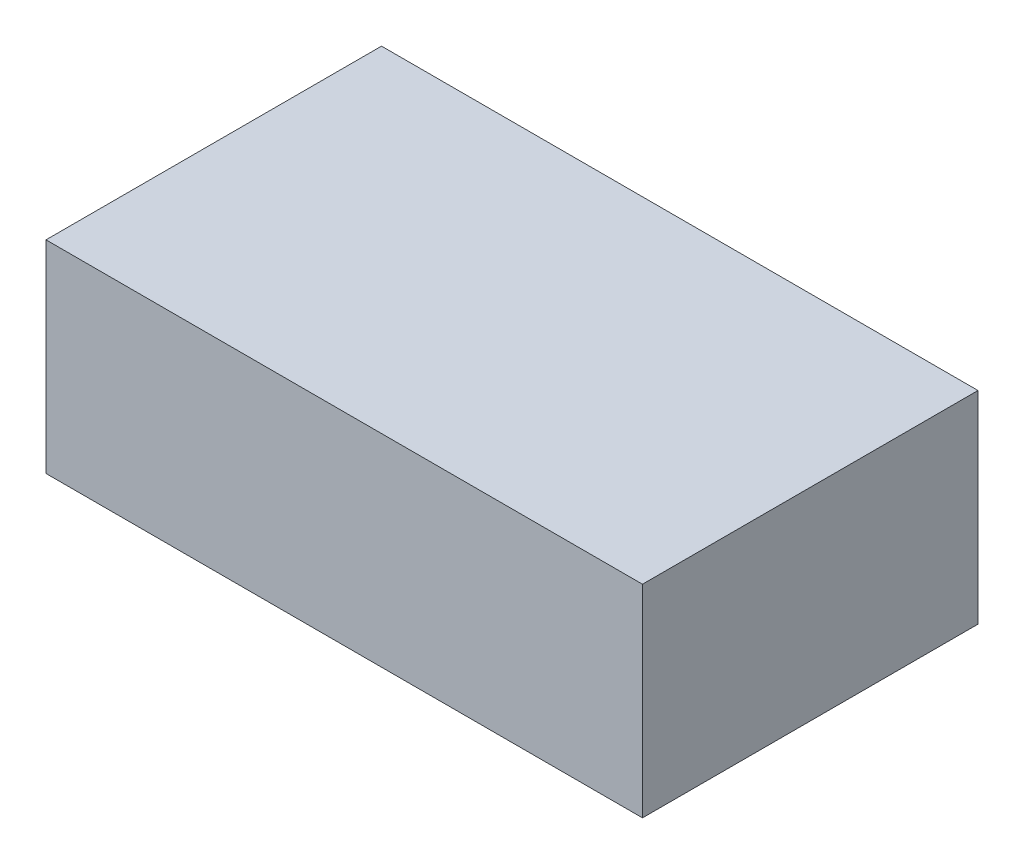
ISO-10303-21;
HEADER;
FILE_DESCRIPTION(('STEP AP214'),'2;1');
FILE_NAME('part.step','',(''),(''),'','','');
FILE_SCHEMA(('AUTOMOTIVE_DESIGN { 1 0 10303 214 1 1 1 1 }'));
ENDSEC;
DATA;
#1=APPLICATION_CONTEXT('core data for automotive mechanical design processes');
#2=APPLICATION_PROTOCOL_DEFINITION('international standard','automotive_design',2000,#1);
#3=PRODUCT_CONTEXT('',#1,'mechanical');
#4=PRODUCT('Part','Part','',(#3));
#5=PRODUCT_RELATED_PRODUCT_CATEGORY('part','',(#4));
#6=PRODUCT_DEFINITION_FORMATION('','',#4);
#7=PRODUCT_DEFINITION_CONTEXT('part definition',#1,'design');
#8=PRODUCT_DEFINITION('design','',#6,#7);
#9=PRODUCT_DEFINITION_SHAPE('','',#8);
#10=(LENGTH_UNIT() NAMED_UNIT(*) SI_UNIT(.MILLI.,.METRE.));
#11=(NAMED_UNIT(*) PLANE_ANGLE_UNIT() SI_UNIT($,.RADIAN.));
#12=(NAMED_UNIT(*) SI_UNIT($,.STERADIAN.) SOLID_ANGLE_UNIT());
#13=UNCERTAINTY_MEASURE_WITH_UNIT(LENGTH_MEASURE(1.E-05),#10,'distance_accuracy_value','');
#14=(GEOMETRIC_REPRESENTATION_CONTEXT(3) GLOBAL_UNCERTAINTY_ASSIGNED_CONTEXT((#13)) GLOBAL_UNIT_ASSIGNED_CONTEXT((#10,
#11,#12)) REPRESENTATION_CONTEXT('',''));
#15=CARTESIAN_POINT('',(0.,0.,0.));
#16=DIRECTION('',(0.,0.,1.));
#17=DIRECTION('',(1.,0.,0.));
#18=AXIS2_PLACEMENT_3D('',#15,#16,#17);
#19=CARTESIAN_POINT('',(56.,38.,-31.5));
#20=DIRECTION('',(-1.,0.,0.));
#21=DIRECTION('',(0.,0.,1.));
#22=AXIS2_PLACEMENT_3D('',#19,#20,#21);
#23=PLANE('',#22);
#24=DIRECTION('',(0.,0.,-1.));
#25=VECTOR('',#24,1.);
#26=CARTESIAN_POINT('',(56.,0.,-31.5));
#27=LINE('',#26,#25);
#28=CARTESIAN_POINT('',(56.,0.,31.5));
#29=VERTEX_POINT('',#28);
#30=CARTESIAN_POINT('',(56.,0.,-31.5));
#31=VERTEX_POINT('',#30);
#32=EDGE_CURVE('E97',#29,#31,#27,.T.);
#33=ORIENTED_EDGE('',*,*,#32,.T.);
#34=DIRECTION('',(0.,-1.,0.));
#35=VECTOR('',#34,1.);
#36=CARTESIAN_POINT('',(56.,38.,-31.5));
#37=LINE('',#36,#35);
#38=CARTESIAN_POINT('',(56.,38.,-31.5));
#39=VERTEX_POINT('',#38);
#40=EDGE_CURVE('E11',#39,#31,#37,.T.);
#41=ORIENTED_EDGE('',*,*,#40,.F.);
#42=DIRECTION('',(0.,0.,-1.));
#43=VECTOR('',#42,1.);
#44=CARTESIAN_POINT('',(56.,38.,-31.5));
#45=LINE('',#44,#43);
#46=CARTESIAN_POINT('',(56.,38.,31.5));
#47=VERTEX_POINT('',#46);
#48=EDGE_CURVE('E85',#47,#39,#45,.T.);
#49=ORIENTED_EDGE('',*,*,#48,.F.);
#50=DIRECTION('',(0.,-1.,0.));
#51=VECTOR('',#50,1.);
#52=CARTESIAN_POINT('',(56.,38.,31.5));
#53=LINE('',#52,#51);
#54=EDGE_CURVE('E93',#47,#29,#53,.T.);
#55=ORIENTED_EDGE('',*,*,#54,.T.);
#56=EDGE_LOOP('',(#33,#41,#49,#55));
#57=FACE_BOUND('',#56,.T.);
#58=ADVANCED_FACE('F34',(#57),#23,.F.);
#59=CARTESIAN_POINT('',(-56.,38.,-31.5));
#60=DIRECTION('',(0.,0.,1.));
#61=DIRECTION('',(1.,0.,0.));
#62=AXIS2_PLACEMENT_3D('',#59,#60,#61);
#63=PLANE('',#62);
#64=DIRECTION('',(-1.,0.,0.));
#65=VECTOR('',#64,1.);
#66=CARTESIAN_POINT('',(-56.,0.,-31.5));
#67=LINE('',#66,#65);
#68=CARTESIAN_POINT('',(-56.,0.,-31.5));
#69=VERTEX_POINT('',#68);
#70=EDGE_CURVE('E89',#31,#69,#67,.T.);
#71=ORIENTED_EDGE('',*,*,#70,.T.);
#72=DIRECTION('',(0.,-1.,0.));
#73=VECTOR('',#72,1.);
#74=CARTESIAN_POINT('',(-56.,38.,-31.5));
#75=LINE('',#74,#73);
#76=CARTESIAN_POINT('',(-56.,38.,-31.5));
#77=VERTEX_POINT('',#76);
#78=EDGE_CURVE('E42',#77,#69,#75,.T.);
#79=ORIENTED_EDGE('',*,*,#78,.F.);
#80=DIRECTION('',(-1.,0.,0.));
#81=VECTOR('',#80,1.);
#82=CARTESIAN_POINT('',(-56.,38.,-31.5));
#83=LINE('',#82,#81);
#84=EDGE_CURVE('E80',#39,#77,#83,.T.);
#85=ORIENTED_EDGE('',*,*,#84,.F.);
#86=ORIENTED_EDGE('',*,*,#40,.T.);
#87=EDGE_LOOP('',(#71,#79,#85,#86));
#88=FACE_BOUND('',#87,.T.);
#89=ADVANCED_FACE('F88',(#88),#63,.F.);
#90=CARTESIAN_POINT('',(-56.,38.,-31.5));
#91=DIRECTION('',(1.,0.,0.));
#92=DIRECTION('',(0.,0.,-1.));
#93=AXIS2_PLACEMENT_3D('',#90,#91,#92);
#94=PLANE('',#93);
#95=DIRECTION('',(0.,0.,1.));
#96=VECTOR('',#95,1.);
#97=CARTESIAN_POINT('',(-56.,0.,-31.5));
#98=LINE('',#97,#96);
#99=CARTESIAN_POINT('',(-56.,0.,31.5));
#100=VERTEX_POINT('',#99);
#101=EDGE_CURVE('E67',#69,#100,#98,.T.);
#102=ORIENTED_EDGE('',*,*,#101,.T.);
#103=DIRECTION('',(0.,-1.,0.));
#104=VECTOR('',#103,1.);
#105=CARTESIAN_POINT('',(-56.,38.,31.5));
#106=LINE('',#105,#104);
#107=CARTESIAN_POINT('',(-56.,38.,31.5));
#108=VERTEX_POINT('',#107);
#109=EDGE_CURVE('E90',#108,#100,#106,.T.);
#110=ORIENTED_EDGE('',*,*,#109,.F.);
#111=DIRECTION('',(0.,0.,1.));
#112=VECTOR('',#111,1.);
#113=CARTESIAN_POINT('',(-56.,38.,-31.5));
#114=LINE('',#113,#112);
#115=EDGE_CURVE('E83',#77,#108,#114,.T.);
#116=ORIENTED_EDGE('',*,*,#115,.F.);
#117=ORIENTED_EDGE('',*,*,#78,.T.);
#118=EDGE_LOOP('',(#102,#110,#116,#117));
#119=FACE_BOUND('',#118,.T.);
#120=ADVANCED_FACE('F91',(#119),#94,.F.);
#121=CARTESIAN_POINT('',(-56.,38.,31.5));
#122=DIRECTION('',(0.,0.,-1.));
#123=DIRECTION('',(-1.,0.,0.));
#124=AXIS2_PLACEMENT_3D('',#121,#122,#123);
#125=PLANE('',#124);
#126=DIRECTION('',(1.,0.,0.));
#127=VECTOR('',#126,1.);
#128=CARTESIAN_POINT('',(-56.,0.,31.5));
#129=LINE('',#128,#127);
#130=EDGE_CURVE('E73',#100,#29,#129,.T.);
#131=ORIENTED_EDGE('',*,*,#130,.T.);
#132=ORIENTED_EDGE('',*,*,#54,.F.);
#133=DIRECTION('',(1.,0.,0.));
#134=VECTOR('',#133,1.);
#135=CARTESIAN_POINT('',(-56.,38.,31.5));
#136=LINE('',#135,#134);
#137=EDGE_CURVE('E50',#108,#47,#136,.T.);
#138=ORIENTED_EDGE('',*,*,#137,.F.);
#139=ORIENTED_EDGE('',*,*,#109,.T.);
#140=EDGE_LOOP('',(#131,#132,#138,#139));
#141=FACE_BOUND('',#140,.T.);
#142=ADVANCED_FACE('F104',(#141),#125,.F.);
#143=CARTESIAN_POINT('',(0.,38.,0.));
#144=DIRECTION('',(0.,1.,0.));
#145=DIRECTION('',(0.,0.,1.));
#146=AXIS2_PLACEMENT_3D('',#143,#144,#145);
#147=PLANE('',#146);
#148=ORIENTED_EDGE('',*,*,#48,.T.);
#149=ORIENTED_EDGE('',*,*,#84,.T.);
#150=ORIENTED_EDGE('',*,*,#115,.T.);
#151=ORIENTED_EDGE('',*,*,#137,.T.);
#152=EDGE_LOOP('',(#148,#149,#150,#151));
#153=FACE_BOUND('',#152,.T.);
#154=ADVANCED_FACE('F81',(#153),#147,.T.);
#155=CARTESIAN_POINT('',(0.,0.,0.));
#156=DIRECTION('',(0.,1.,0.));
#157=DIRECTION('',(0.,0.,1.));
#158=AXIS2_PLACEMENT_3D('',#155,#156,#157);
#159=PLANE('',#158);
#160=ORIENTED_EDGE('',*,*,#32,.F.);
#161=ORIENTED_EDGE('',*,*,#130,.F.);
#162=ORIENTED_EDGE('',*,*,#101,.F.);
#163=ORIENTED_EDGE('',*,*,#70,.F.);
#164=EDGE_LOOP('',(#160,#161,#162,#163));
#165=FACE_BOUND('',#164,.T.);
#166=ADVANCED_FACE('F107',(#165),#159,.F.);
#167=CLOSED_SHELL('',(#58,#89,#120,#142,#154,#166));
#168=MANIFOLD_SOLID_BREP('B2',#167);
#169=ADVANCED_BREP_SHAPE_REPRESENTATION('',(#18,#168),#14);
#170=SHAPE_DEFINITION_REPRESENTATION(#9,#169);
ENDSEC;
END-ISO-10303-21;
